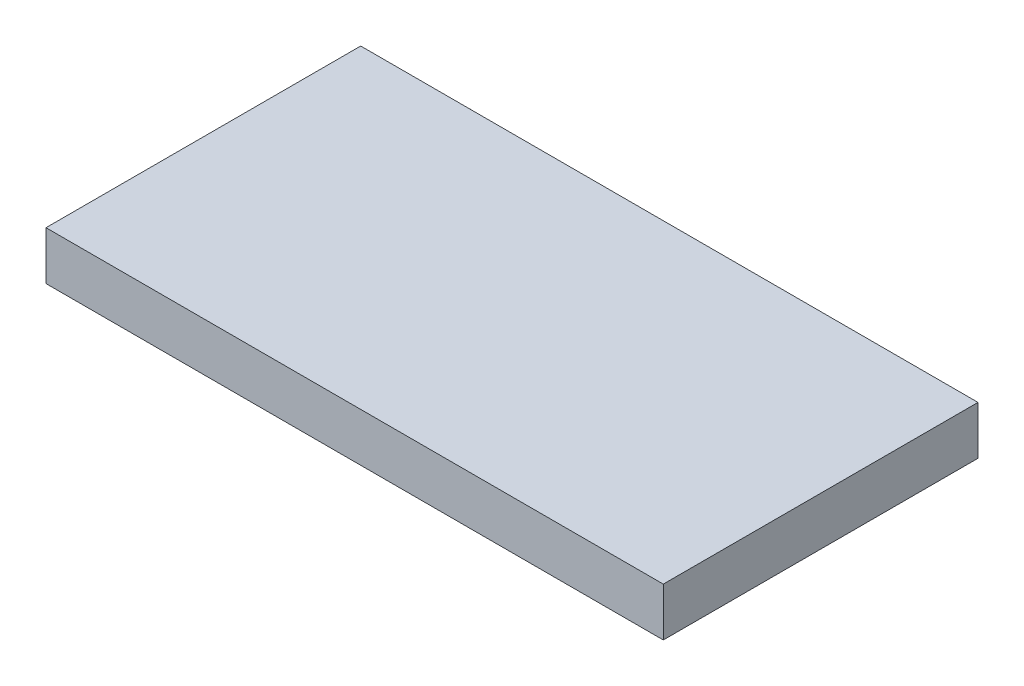
ISO-10303-21;
HEADER;
FILE_DESCRIPTION(('STEP AP214'),'2;1');
FILE_NAME('part.step','',(''),(''),'','','');
FILE_SCHEMA(('AUTOMOTIVE_DESIGN { 1 0 10303 214 1 1 1 1 }'));
ENDSEC;
DATA;
#1=APPLICATION_CONTEXT('core data for automotive mechanical design processes');
#2=APPLICATION_PROTOCOL_DEFINITION('international standard','automotive_design',2000,#1);
#3=PRODUCT_CONTEXT('',#1,'mechanical');
#4=PRODUCT('Part','Part','',(#3));
#5=PRODUCT_RELATED_PRODUCT_CATEGORY('part','',(#4));
#6=PRODUCT_DEFINITION_FORMATION('','',#4);
#7=PRODUCT_DEFINITION_CONTEXT('part definition',#1,'design');
#8=PRODUCT_DEFINITION('design','',#6,#7);
#9=PRODUCT_DEFINITION_SHAPE('','',#8);
#10=(LENGTH_UNIT() NAMED_UNIT(*) SI_UNIT(.MILLI.,.METRE.));
#11=(NAMED_UNIT(*) PLANE_ANGLE_UNIT() SI_UNIT($,.RADIAN.));
#12=(NAMED_UNIT(*) SI_UNIT($,.STERADIAN.) SOLID_ANGLE_UNIT());
#13=UNCERTAINTY_MEASURE_WITH_UNIT(LENGTH_MEASURE(1.E-05),#10,'distance_accuracy_value','');
#14=(GEOMETRIC_REPRESENTATION_CONTEXT(3) GLOBAL_UNCERTAINTY_ASSIGNED_CONTEXT((#13)) GLOBAL_UNIT_ASSIGNED_CONTEXT((#10,
#11,#12)) REPRESENTATION_CONTEXT('',''));
#15=CARTESIAN_POINT('',(0.,0.,0.));
#16=DIRECTION('',(0.,0.,1.));
#17=DIRECTION('',(1.,0.,0.));
#18=AXIS2_PLACEMENT_3D('',#15,#16,#17);
#19=CARTESIAN_POINT('',(0.,4.,0.));
#20=DIRECTION('',(0.,0.,-1.));
#21=DIRECTION('',(-1.,0.,0.));
#22=AXIS2_PLACEMENT_3D('',#19,#20,#21);
#23=PLANE('',#22);
#24=DIRECTION('',(1.,0.,0.));
#25=VECTOR('',#24,1.);
#26=CARTESIAN_POINT('',(0.,0.,0.));
#27=LINE('',#26,#25);
#28=CARTESIAN_POINT('',(0.,0.,0.));
#29=VERTEX_POINT('',#28);
#30=CARTESIAN_POINT('',(51.,0.,0.));
#31=VERTEX_POINT('',#30);
#32=EDGE_CURVE('E98',#29,#31,#27,.T.);
#33=ORIENTED_EDGE('',*,*,#32,.T.);
#34=DIRECTION('',(0.,-1.,0.));
#35=VECTOR('',#34,1.);
#36=CARTESIAN_POINT('',(51.,4.,0.));
#37=LINE('',#36,#35);
#38=CARTESIAN_POINT('',(51.,4.,0.));
#39=VERTEX_POINT('',#38);
#40=EDGE_CURVE('E11',#39,#31,#37,.T.);
#41=ORIENTED_EDGE('',*,*,#40,.F.);
#42=DIRECTION('',(1.,0.,0.));
#43=VECTOR('',#42,1.);
#44=CARTESIAN_POINT('',(0.,4.,0.));
#45=LINE('',#44,#43);
#46=CARTESIAN_POINT('',(0.,4.,0.));
#47=VERTEX_POINT('',#46);
#48=EDGE_CURVE('E84',#47,#39,#45,.T.);
#49=ORIENTED_EDGE('',*,*,#48,.F.);
#50=DIRECTION('',(0.,-1.,0.));
#51=VECTOR('',#50,1.);
#52=CARTESIAN_POINT('',(0.,4.,0.));
#53=LINE('',#52,#51);
#54=EDGE_CURVE('E51',#47,#29,#53,.T.);
#55=ORIENTED_EDGE('',*,*,#54,.T.);
#56=EDGE_LOOP('',(#33,#41,#49,#55));
#57=FACE_BOUND('',#56,.T.);
#58=ADVANCED_FACE('F35',(#57),#23,.F.);
#59=CARTESIAN_POINT('',(51.,4.,0.));
#60=DIRECTION('',(-1.,0.,0.));
#61=DIRECTION('',(0.,0.,1.));
#62=AXIS2_PLACEMENT_3D('',#59,#60,#61);
#63=PLANE('',#62);
#64=DIRECTION('',(0.,0.,-1.));
#65=VECTOR('',#64,1.);
#66=CARTESIAN_POINT('',(51.,0.,0.));
#67=LINE('',#66,#65);
#68=CARTESIAN_POINT('',(51.,0.,-26.));
#69=VERTEX_POINT('',#68);
#70=EDGE_CURVE('E89',#31,#69,#67,.T.);
#71=ORIENTED_EDGE('',*,*,#70,.T.);
#72=DIRECTION('',(0.,-1.,0.));
#73=VECTOR('',#72,1.);
#74=CARTESIAN_POINT('',(51.,4.,-26.));
#75=LINE('',#74,#73);
#76=CARTESIAN_POINT('',(51.,4.,-26.));
#77=VERTEX_POINT('',#76);
#78=EDGE_CURVE('E43',#77,#69,#75,.T.);
#79=ORIENTED_EDGE('',*,*,#78,.F.);
#80=DIRECTION('',(0.,0.,-1.));
#81=VECTOR('',#80,1.);
#82=CARTESIAN_POINT('',(51.,4.,0.));
#83=LINE('',#82,#81);
#84=EDGE_CURVE('E76',#39,#77,#83,.T.);
#85=ORIENTED_EDGE('',*,*,#84,.F.);
#86=ORIENTED_EDGE('',*,*,#40,.T.);
#87=EDGE_LOOP('',(#71,#79,#85,#86));
#88=FACE_BOUND('',#87,.T.);
#89=ADVANCED_FACE('F88',(#88),#63,.F.);
#90=CARTESIAN_POINT('',(0.,4.,-26.));
#91=DIRECTION('',(0.,0.,-1.));
#92=DIRECTION('',(-1.,0.,0.));
#93=AXIS2_PLACEMENT_3D('',#90,#91,#92);
#94=PLANE('',#93);
#95=DIRECTION('',(1.,0.,0.));
#96=VECTOR('',#95,1.);
#97=CARTESIAN_POINT('',(0.,0.,-26.));
#98=LINE('',#97,#96);
#99=CARTESIAN_POINT('',(0.,0.,-26.));
#100=VERTEX_POINT('',#99);
#101=EDGE_CURVE('E101',#100,#69,#98,.T.);
#102=ORIENTED_EDGE('',*,*,#101,.F.);
#103=DIRECTION('',(0.,-1.,0.));
#104=VECTOR('',#103,1.);
#105=CARTESIAN_POINT('',(0.,4.,-26.));
#106=LINE('',#105,#104);
#107=CARTESIAN_POINT('',(0.,4.,-26.));
#108=VERTEX_POINT('',#107);
#109=EDGE_CURVE('E65',#108,#100,#106,.T.);
#110=ORIENTED_EDGE('',*,*,#109,.F.);
#111=DIRECTION('',(1.,0.,0.));
#112=VECTOR('',#111,1.);
#113=CARTESIAN_POINT('',(0.,4.,-26.));
#114=LINE('',#113,#112);
#115=EDGE_CURVE('E83',#108,#77,#114,.T.);
#116=ORIENTED_EDGE('',*,*,#115,.T.);
#117=ORIENTED_EDGE('',*,*,#78,.T.);
#118=EDGE_LOOP('',(#102,#110,#116,#117));
#119=FACE_BOUND('',#118,.T.);
#120=ADVANCED_FACE('F92',(#119),#94,.T.);
#121=CARTESIAN_POINT('',(0.,4.,0.));
#122=DIRECTION('',(-1.,0.,0.));
#123=DIRECTION('',(0.,0.,1.));
#124=AXIS2_PLACEMENT_3D('',#121,#122,#123);
#125=PLANE('',#124);
#126=DIRECTION('',(0.,0.,-1.));
#127=VECTOR('',#126,1.);
#128=CARTESIAN_POINT('',(0.,0.,0.));
#129=LINE('',#128,#127);
#130=EDGE_CURVE('E103',#29,#100,#129,.T.);
#131=ORIENTED_EDGE('',*,*,#130,.F.);
#132=ORIENTED_EDGE('',*,*,#54,.F.);
#133=DIRECTION('',(0.,0.,-1.));
#134=VECTOR('',#133,1.);
#135=CARTESIAN_POINT('',(0.,4.,0.));
#136=LINE('',#135,#134);
#137=EDGE_CURVE('E93',#47,#108,#136,.T.);
#138=ORIENTED_EDGE('',*,*,#137,.T.);
#139=ORIENTED_EDGE('',*,*,#109,.T.);
#140=EDGE_LOOP('',(#131,#132,#138,#139));
#141=FACE_BOUND('',#140,.T.);
#142=ADVANCED_FACE('F109',(#141),#125,.T.);
#143=CARTESIAN_POINT('',(0.,4.,0.));
#144=DIRECTION('',(0.,1.,0.));
#145=DIRECTION('',(0.,0.,1.));
#146=AXIS2_PLACEMENT_3D('',#143,#144,#145);
#147=PLANE('',#146);
#148=ORIENTED_EDGE('',*,*,#48,.T.);
#149=ORIENTED_EDGE('',*,*,#84,.T.);
#150=ORIENTED_EDGE('',*,*,#115,.F.);
#151=ORIENTED_EDGE('',*,*,#137,.F.);
#152=EDGE_LOOP('',(#148,#149,#150,#151));
#153=FACE_BOUND('',#152,.T.);
#154=ADVANCED_FACE('F80',(#153),#147,.T.);
#155=CARTESIAN_POINT('',(0.,0.,0.));
#156=DIRECTION('',(0.,1.,0.));
#157=DIRECTION('',(0.,0.,1.));
#158=AXIS2_PLACEMENT_3D('',#155,#156,#157);
#159=PLANE('',#158);
#160=ORIENTED_EDGE('',*,*,#32,.F.);
#161=ORIENTED_EDGE('',*,*,#130,.T.);
#162=ORIENTED_EDGE('',*,*,#101,.T.);
#163=ORIENTED_EDGE('',*,*,#70,.F.);
#164=EDGE_LOOP('',(#160,#161,#162,#163));
#165=FACE_BOUND('',#164,.T.);
#166=ADVANCED_FACE('F108',(#165),#159,.F.);
#167=CLOSED_SHELL('',(#58,#89,#120,#142,#154,#166));
#168=MANIFOLD_SOLID_BREP('B2',#167);
#169=ADVANCED_BREP_SHAPE_REPRESENTATION('',(#18,#168),#14);
#170=SHAPE_DEFINITION_REPRESENTATION(#9,#169);
ENDSEC;
END-ISO-10303-21;
